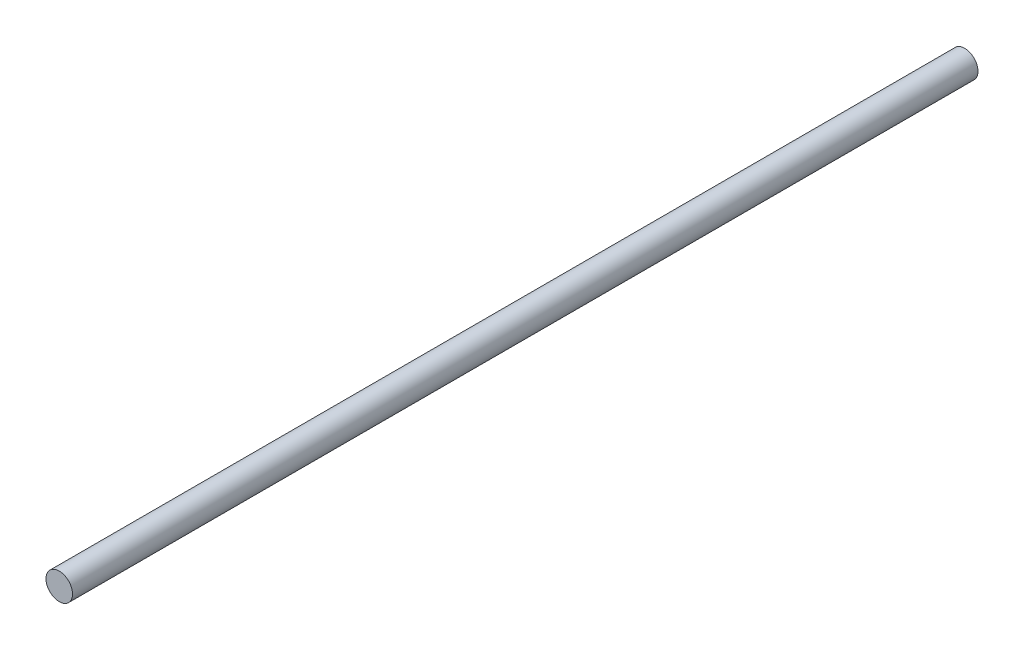
ISO-10303-21;
HEADER;
FILE_DESCRIPTION(('STEP AP214'),'2;1');
FILE_NAME('part.step','',(''),(''),'','','');
FILE_SCHEMA(('AUTOMOTIVE_DESIGN { 1 0 10303 214 1 1 1 1 }'));
ENDSEC;
DATA;
#1=APPLICATION_CONTEXT('core data for automotive mechanical design processes');
#2=APPLICATION_PROTOCOL_DEFINITION('international standard','automotive_design',2000,#1);
#3=PRODUCT_CONTEXT('',#1,'mechanical');
#4=PRODUCT('Part','Part','',(#3));
#5=PRODUCT_RELATED_PRODUCT_CATEGORY('part','',(#4));
#6=PRODUCT_DEFINITION_FORMATION('','',#4);
#7=PRODUCT_DEFINITION_CONTEXT('part definition',#1,'design');
#8=PRODUCT_DEFINITION('design','',#6,#7);
#9=PRODUCT_DEFINITION_SHAPE('','',#8);
#10=(LENGTH_UNIT() NAMED_UNIT(*) SI_UNIT(.MILLI.,.METRE.));
#11=(NAMED_UNIT(*) PLANE_ANGLE_UNIT() SI_UNIT($,.RADIAN.));
#12=(NAMED_UNIT(*) SI_UNIT($,.STERADIAN.) SOLID_ANGLE_UNIT());
#13=UNCERTAINTY_MEASURE_WITH_UNIT(LENGTH_MEASURE(1.E-05),#10,'distance_accuracy_value','');
#14=(GEOMETRIC_REPRESENTATION_CONTEXT(3) GLOBAL_UNCERTAINTY_ASSIGNED_CONTEXT((#13)) GLOBAL_UNIT_ASSIGNED_CONTEXT((#10,
#11,#12)) REPRESENTATION_CONTEXT('',''));
#15=CARTESIAN_POINT('',(0.,0.,0.));
#16=DIRECTION('',(0.,0.,1.));
#17=DIRECTION('',(1.,0.,0.));
#18=AXIS2_PLACEMENT_3D('',#15,#16,#17);
#19=CARTESIAN_POINT('',(0.,0.,204.7));
#20=DIRECTION('',(0.,0.,-1.));
#21=DIRECTION('',(-1.,0.,0.));
#22=AXIS2_PLACEMENT_3D('',#19,#20,#21);
#23=CYLINDRICAL_SURFACE('',#22,3.);
#24=CARTESIAN_POINT('',(0.,0.,204.7));
#25=DIRECTION('',(0.,0.,1.));
#26=DIRECTION('',(1.,0.,0.));
#27=AXIS2_PLACEMENT_3D('',#24,#25,#26);
#28=CIRCLE('',#27,3.);
#29=CARTESIAN_POINT('',(3.,0.,204.7));
#30=VERTEX_POINT('',#29);
#31=EDGE_CURVE('E10',#30,#30,#28,.T.);
#32=ORIENTED_EDGE('',*,*,#31,.F.);
#33=EDGE_LOOP('',(#32));
#34=FACE_BOUND('',#33,.T.);
#35=CARTESIAN_POINT('',(0.,0.,0.));
#36=DIRECTION('',(0.,0.,1.));
#37=DIRECTION('',(1.,0.,0.));
#38=AXIS2_PLACEMENT_3D('',#35,#36,#37);
#39=CIRCLE('',#38,3.);
#40=CARTESIAN_POINT('',(3.,0.,0.));
#41=VERTEX_POINT('',#40);
#42=EDGE_CURVE('E35',#41,#41,#39,.T.);
#43=ORIENTED_EDGE('',*,*,#42,.T.);
#44=EDGE_LOOP('',(#43));
#45=FACE_BOUND('',#44,.T.);
#46=ADVANCED_FACE('F32',(#34,#45),#23,.T.);
#47=CARTESIAN_POINT('',(0.,0.,204.7));
#48=DIRECTION('',(0.,0.,1.));
#49=DIRECTION('',(1.,0.,0.));
#50=AXIS2_PLACEMENT_3D('',#47,#48,#49);
#51=PLANE('',#50);
#52=ORIENTED_EDGE('',*,*,#31,.T.);
#53=EDGE_LOOP('',(#52));
#54=FACE_BOUND('',#53,.T.);
#55=ADVANCED_FACE('F47',(#54),#51,.T.);
#56=CARTESIAN_POINT('',(0.,0.,0.));
#57=DIRECTION('',(0.,0.,1.));
#58=DIRECTION('',(1.,0.,0.));
#59=AXIS2_PLACEMENT_3D('',#56,#57,#58);
#60=PLANE('',#59);
#61=ORIENTED_EDGE('',*,*,#42,.F.);
#62=EDGE_LOOP('',(#61));
#63=FACE_BOUND('',#62,.T.);
#64=ADVANCED_FACE('F45',(#63),#60,.F.);
#65=CLOSED_SHELL('',(#46,#55,#64));
#66=MANIFOLD_SOLID_BREP('B2',#65);
#67=ADVANCED_BREP_SHAPE_REPRESENTATION('',(#18,#66),#14);
#68=SHAPE_DEFINITION_REPRESENTATION(#9,#67);
ENDSEC;
END-ISO-10303-21;
